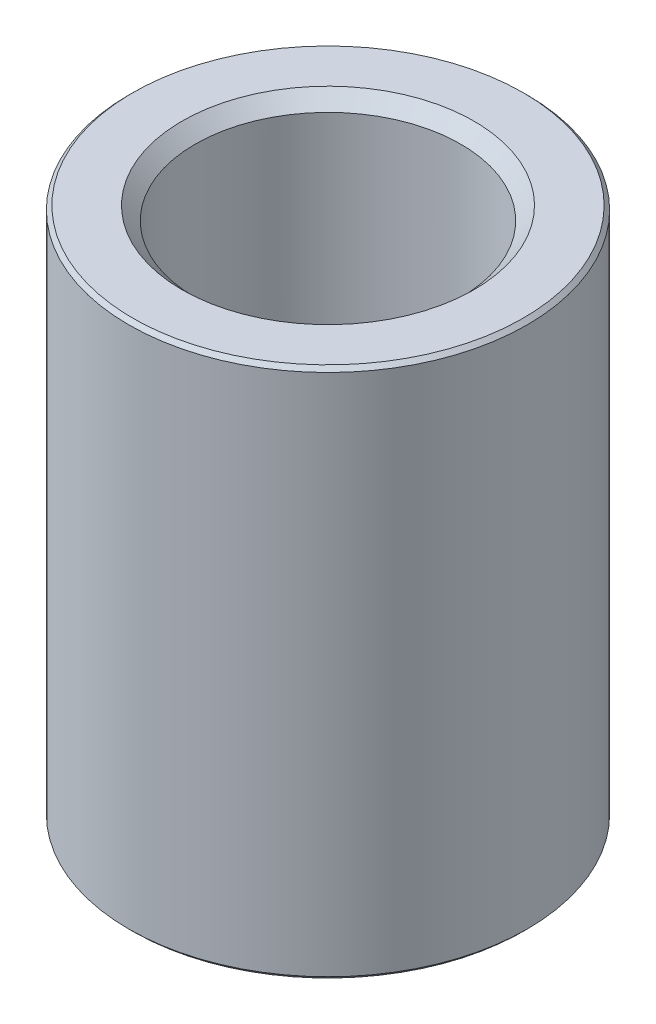
ISO-10303-21;
HEADER;
FILE_DESCRIPTION(('STEP AP214'),'2;1');
FILE_NAME('part.step','',(''),(''),'','','');
FILE_SCHEMA(('AUTOMOTIVE_DESIGN { 1 0 10303 214 1 1 1 1 }'));
ENDSEC;
DATA;
#1=APPLICATION_CONTEXT('core data for automotive mechanical design processes');
#2=APPLICATION_PROTOCOL_DEFINITION('international standard','automotive_design',2000,#1);
#3=PRODUCT_CONTEXT('',#1,'mechanical');
#4=PRODUCT('Part','Part','',(#3));
#5=PRODUCT_RELATED_PRODUCT_CATEGORY('part','',(#4));
#6=PRODUCT_DEFINITION_FORMATION('','',#4);
#7=PRODUCT_DEFINITION_CONTEXT('part definition',#1,'design');
#8=PRODUCT_DEFINITION('design','',#6,#7);
#9=PRODUCT_DEFINITION_SHAPE('','',#8);
#10=(LENGTH_UNIT() NAMED_UNIT(*) SI_UNIT(.MILLI.,.METRE.));
#11=(NAMED_UNIT(*) PLANE_ANGLE_UNIT() SI_UNIT($,.RADIAN.));
#12=(NAMED_UNIT(*) SI_UNIT($,.STERADIAN.) SOLID_ANGLE_UNIT());
#13=UNCERTAINTY_MEASURE_WITH_UNIT(LENGTH_MEASURE(1.E-05),#10,'distance_accuracy_value','');
#14=(GEOMETRIC_REPRESENTATION_CONTEXT(3) GLOBAL_UNCERTAINTY_ASSIGNED_CONTEXT((#13)) GLOBAL_UNIT_ASSIGNED_CONTEXT((#10,
#11,#12)) REPRESENTATION_CONTEXT('',''));
#15=CARTESIAN_POINT('',(0.,0.,0.));
#16=DIRECTION('',(0.,0.,1.));
#17=DIRECTION('',(1.,0.,0.));
#18=AXIS2_PLACEMENT_3D('',#15,#16,#17);
#19=CARTESIAN_POINT('',(-2.02279950000574,-9.29966050013432,21.0640001071558));
#20=DIRECTION('',(0.,1.,0.));
#21=DIRECTION('',(0.,0.,1.));
#22=AXIS2_PLACEMENT_3D('',#19,#20,#21);
#23=CYLINDRICAL_SURFACE('',#22,2.);
#24=CARTESIAN_POINT('',(-2.02279950000582,-5.49966050016333,21.0640001071557));
#25=DIRECTION('',(0.,1.,0.));
#26=DIRECTION('',(-1.,0.,0.));
#27=AXIS2_PLACEMENT_3D('',#24,#25,#26);
#28=CIRCLE('',#27,1.99999999997237);
#29=CARTESIAN_POINT('',(-4.02279949997819,-5.49966050016337,21.0640001071557));
#30=VERTEX_POINT('',#29);
#31=EDGE_CURVE('E33',#30,#30,#28,.T.);
#32=ORIENTED_EDGE('',*,*,#31,.T.);
#33=EDGE_LOOP('',(#32));
#34=FACE_BOUND('',#33,.T.);
#35=CARTESIAN_POINT('',(-2.02279950000565,-13.0996605000746,21.0640001071559));
#36=DIRECTION('',(0.,-1.,0.));
#37=DIRECTION('',(-1.,0.,0.));
#38=AXIS2_PLACEMENT_3D('',#35,#36,#37);
#39=CIRCLE('',#38,1.99999999997254);
#40=CARTESIAN_POINT('',(-4.02279949997819,-13.0996605000746,21.0640001071559));
#41=VERTEX_POINT('',#40);
#42=EDGE_CURVE('E36',#41,#41,#39,.T.);
#43=ORIENTED_EDGE('',*,*,#42,.T.);
#44=EDGE_LOOP('',(#43));
#45=FACE_BOUND('',#44,.T.);
#46=ADVANCED_FACE('F14',(#34,#45),#23,.F.);
#47=CARTESIAN_POINT('',(-2.02279950000565,-13.299660500138,21.0640001071559));
#48=DIRECTION('',(0.,-1.,0.));
#49=DIRECTION('',(1.,0.,0.));
#50=AXIS2_PLACEMENT_3D('',#47,#48,#49);
#51=CONICAL_SURFACE('',#50,2.20000000003603,0.785398163397472);
#52=ORIENTED_EDGE('',*,*,#42,.F.);
#53=EDGE_LOOP('',(#52));
#54=FACE_BOUND('',#53,.T.);
#55=CARTESIAN_POINT('',(-2.02279950000565,-13.299660500175,21.0640001071559));
#56=DIRECTION('',(0.,-1.,0.));
#57=DIRECTION('',(1.,0.,0.));
#58=AXIS2_PLACEMENT_3D('',#55,#56,#57);
#59=CIRCLE('',#58,2.20000000007303);
#60=CARTESIAN_POINT('',(0.177200500067385,-13.299660500175,21.0640001071559));
#61=VERTEX_POINT('',#60);
#62=EDGE_CURVE('E17',#61,#61,#59,.F.);
#63=ORIENTED_EDGE('',*,*,#62,.F.);
#64=EDGE_LOOP('',(#63));
#65=FACE_BOUND('',#64,.T.);
#66=ADVANCED_FACE('F53',(#54,#65),#51,.F.);
#67=CARTESIAN_POINT('',(-2.02279950000582,-5.29966050032721,21.0640001071557));
#68=DIRECTION('',(0.,1.,0.));
#69=DIRECTION('',(0.,0.,1.));
#70=AXIS2_PLACEMENT_3D('',#67,#68,#69);
#71=CONICAL_SURFACE('',#70,2.19999999980848,0.785398163397424);
#72=ORIENTED_EDGE('',*,*,#31,.F.);
#73=EDGE_LOOP('',(#72));
#74=FACE_BOUND('',#73,.T.);
#75=CARTESIAN_POINT('',(-2.02279950000582,-5.29966050015673,21.0640001071557));
#76=DIRECTION('',(0.,1.,0.));
#77=DIRECTION('',(0.,0.,1.));
#78=AXIS2_PLACEMENT_3D('',#75,#76,#77);
#79=CIRCLE('',#78,2.19999999997896);
#80=CARTESIAN_POINT('',(-2.02279950000582,-5.29966050015668,23.2640001071347));
#81=VERTEX_POINT('',#80);
#82=EDGE_CURVE('E43',#81,#81,#79,.F.);
#83=ORIENTED_EDGE('',*,*,#82,.F.);
#84=EDGE_LOOP('',(#83));
#85=FACE_BOUND('',#84,.T.);
#86=ADVANCED_FACE('F55',(#74,#85),#71,.F.);
#87=CARTESIAN_POINT('',(-2.02279950000565,-13.2996605001343,21.0640001071559));
#88=DIRECTION('',(0.,-1.,0.));
#89=DIRECTION('',(0.,0.,-1.));
#90=AXIS2_PLACEMENT_3D('',#87,#88,#89);
#91=PLANE('',#90);
#92=ORIENTED_EDGE('',*,*,#62,.T.);
#93=EDGE_LOOP('',(#92));
#94=FACE_BOUND('',#93,.T.);
#95=CARTESIAN_POINT('',(-2.02279950000565,-13.2996605001381,21.0640001071559));
#96=DIRECTION('',(0.,1.,0.));
#97=DIRECTION('',(-1.,0.,0.));
#98=AXIS2_PLACEMENT_3D('',#95,#96,#97);
#99=CIRCLE('',#98,2.94142135614651);
#100=CARTESIAN_POINT('',(-4.96422085615216,-13.2996605001382,21.0640001071559));
#101=VERTEX_POINT('',#100);
#102=EDGE_CURVE('E41',#101,#101,#99,.T.);
#103=ORIENTED_EDGE('',*,*,#102,.F.);
#104=EDGE_LOOP('',(#103));
#105=FACE_BOUND('',#104,.T.);
#106=ADVANCED_FACE('F50',(#94,#105),#91,.T.);
#107=CARTESIAN_POINT('',(-2.02279950000583,-5.29966050013432,21.0640001071557));
#108=DIRECTION('',(0.,1.,0.));
#109=DIRECTION('',(0.,0.,1.));
#110=AXIS2_PLACEMENT_3D('',#107,#108,#109);
#111=PLANE('',#110);
#112=ORIENTED_EDGE('',*,*,#82,.T.);
#113=EDGE_LOOP('',(#112));
#114=FACE_BOUND('',#113,.T.);
#115=CARTESIAN_POINT('',(-2.02279950000582,-5.29966050008016,21.0640001071557));
#116=DIRECTION('',(0.,-1.,0.));
#117=DIRECTION('',(0.,0.,-1.));
#118=AXIS2_PLACEMENT_3D('',#115,#116,#117);
#119=CIRCLE('',#118,2.94142135612674);
#120=CARTESIAN_POINT('',(-2.02279950000582,-5.29966050008023,18.122578751029));
#121=VERTEX_POINT('',#120);
#122=EDGE_CURVE('E26',#121,#121,#119,.T.);
#123=ORIENTED_EDGE('',*,*,#122,.F.);
#124=EDGE_LOOP('',(#123));
#125=FACE_BOUND('',#124,.T.);
#126=ADVANCED_FACE('F80',(#114,#125),#111,.T.);
#127=CARTESIAN_POINT('',(-2.02279950000565,-13.2410818562789,21.0640001071559));
#128=DIRECTION('',(0.,1.,0.));
#129=DIRECTION('',(-1.,0.,0.));
#130=AXIS2_PLACEMENT_3D('',#127,#128,#129);
#131=CONICAL_SURFACE('',#130,3.00000000000574,0.785398163397423);
#132=CARTESIAN_POINT('',(-2.02279950000565,-13.2410818563716,21.0640001071559));
#133=DIRECTION('',(0.,-1.,0.));
#134=DIRECTION('',(0.,0.,-1.));
#135=AXIS2_PLACEMENT_3D('',#132,#133,#134);
#136=CIRCLE('',#135,3.);
#137=CARTESIAN_POINT('',(-2.02279950000565,-13.2410818563717,18.0640001071559));
#138=VERTEX_POINT('',#137);
#139=EDGE_CURVE('E21',#138,#138,#136,.F.);
#140=ORIENTED_EDGE('',*,*,#139,.F.);
#141=EDGE_LOOP('',(#140));
#142=FACE_BOUND('',#141,.T.);
#143=ORIENTED_EDGE('',*,*,#102,.T.);
#144=EDGE_LOOP('',(#143));
#145=FACE_BOUND('',#144,.T.);
#146=ADVANCED_FACE('F73',(#142,#145),#131,.T.);
#147=CARTESIAN_POINT('',(-2.02279950000582,-5.3582391438453,21.0640001071557));
#148=DIRECTION('',(0.,-1.,0.));
#149=DIRECTION('',(0.,0.,-1.));
#150=AXIS2_PLACEMENT_3D('',#147,#148,#149);
#151=CONICAL_SURFACE('',#150,2.99999999989188,0.785398163397467);
#152=CARTESIAN_POINT('',(-2.02279950000583,-5.35823914389701,21.0640001071557));
#153=DIRECTION('',(0.,-1.,0.));
#154=DIRECTION('',(0.,0.,-1.));
#155=AXIS2_PLACEMENT_3D('',#152,#153,#154);
#156=CIRCLE('',#155,3.);
#157=CARTESIAN_POINT('',(-2.02279950000583,-5.35823914389708,18.0640001071557));
#158=VERTEX_POINT('',#157);
#159=EDGE_CURVE('E10',#158,#158,#156,.T.);
#160=ORIENTED_EDGE('',*,*,#159,.F.);
#161=EDGE_LOOP('',(#160));
#162=FACE_BOUND('',#161,.T.);
#163=ORIENTED_EDGE('',*,*,#122,.T.);
#164=EDGE_LOOP('',(#163));
#165=FACE_BOUND('',#164,.T.);
#166=ADVANCED_FACE('F68',(#162,#165),#151,.T.);
#167=CARTESIAN_POINT('',(-2.02279950000574,-9.29966050013432,21.0640001071558));
#168=DIRECTION('',(0.,-1.,0.));
#169=DIRECTION('',(0.,0.,-1.));
#170=AXIS2_PLACEMENT_3D('',#167,#168,#169);
#171=CYLINDRICAL_SURFACE('',#170,3.);
#172=ORIENTED_EDGE('',*,*,#159,.T.);
#173=EDGE_LOOP('',(#172));
#174=FACE_BOUND('',#173,.T.);
#175=ORIENTED_EDGE('',*,*,#139,.T.);
#176=EDGE_LOOP('',(#175));
#177=FACE_BOUND('',#176,.T.);
#178=ADVANCED_FACE('F66',(#174,#177),#171,.T.);
#179=CLOSED_SHELL('',(#46,#66,#86,#106,#126,#146,#166,#178));
#180=MANIFOLD_SOLID_BREP('B1',#179);
#181=ADVANCED_BREP_SHAPE_REPRESENTATION('',(#18,#180),#14);
#182=SHAPE_DEFINITION_REPRESENTATION(#9,#181);
ENDSEC;
END-ISO-10303-21;
